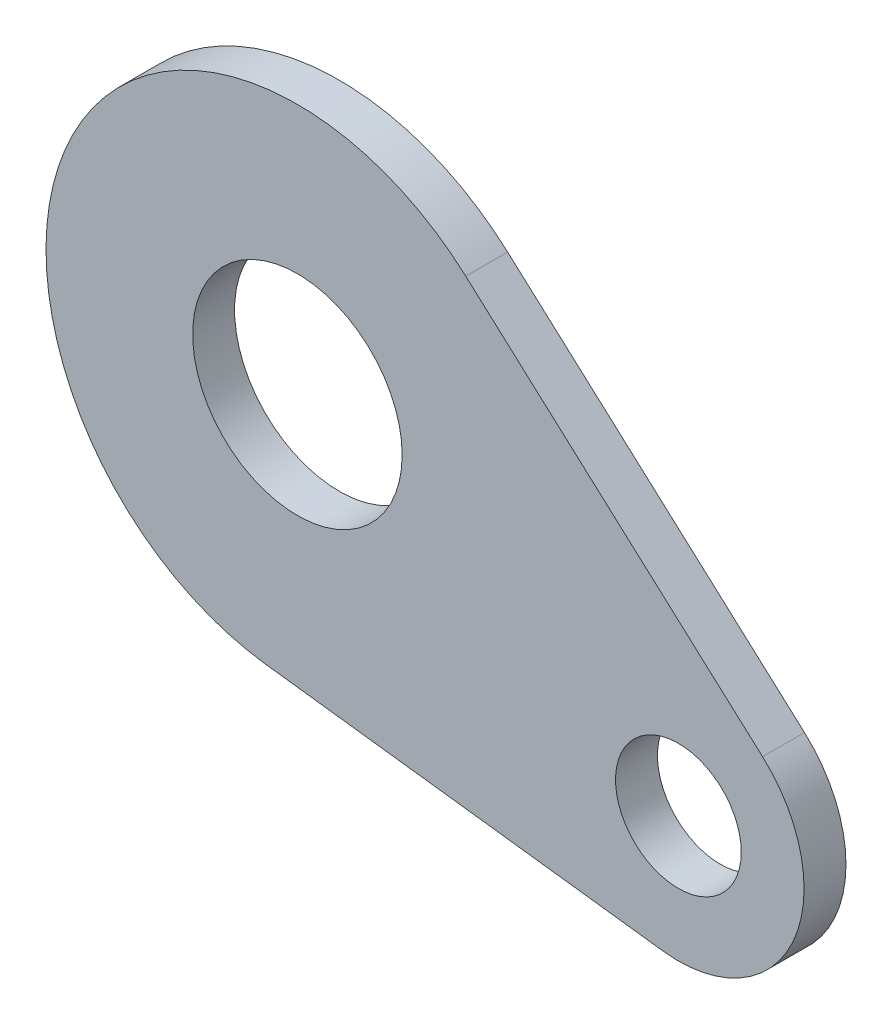
ISO-10303-21;
HEADER;
FILE_DESCRIPTION(('STEP AP214'),'2;1');
FILE_NAME('part.step','',(''),(''),'','','');
FILE_SCHEMA(('AUTOMOTIVE_DESIGN { 1 0 10303 214 1 1 1 1 }'));
ENDSEC;
DATA;
#1=APPLICATION_CONTEXT('core data for automotive mechanical design processes');
#2=APPLICATION_PROTOCOL_DEFINITION('international standard','automotive_design',2000,#1);
#3=PRODUCT_CONTEXT('',#1,'mechanical');
#4=PRODUCT('Part','Part','',(#3));
#5=PRODUCT_RELATED_PRODUCT_CATEGORY('part','',(#4));
#6=PRODUCT_DEFINITION_FORMATION('','',#4);
#7=PRODUCT_DEFINITION_CONTEXT('part definition',#1,'design');
#8=PRODUCT_DEFINITION('design','',#6,#7);
#9=PRODUCT_DEFINITION_SHAPE('','',#8);
#10=(LENGTH_UNIT() NAMED_UNIT(*) SI_UNIT(.MILLI.,.METRE.));
#11=(NAMED_UNIT(*) PLANE_ANGLE_UNIT() SI_UNIT($,.RADIAN.));
#12=(NAMED_UNIT(*) SI_UNIT($,.STERADIAN.) SOLID_ANGLE_UNIT());
#13=UNCERTAINTY_MEASURE_WITH_UNIT(LENGTH_MEASURE(1.E-05),#10,'distance_accuracy_value','');
#14=(GEOMETRIC_REPRESENTATION_CONTEXT(3) GLOBAL_UNCERTAINTY_ASSIGNED_CONTEXT((#13)) GLOBAL_UNIT_ASSIGNED_CONTEXT((#10,
#11,#12)) REPRESENTATION_CONTEXT('',''));
#15=CARTESIAN_POINT('',(0.,0.,0.));
#16=DIRECTION('',(0.,0.,1.));
#17=DIRECTION('',(1.,0.,0.));
#18=AXIS2_PLACEMENT_3D('',#15,#16,#17);
#19=CARTESIAN_POINT('',(-104.570506238801,47.8540408425545,1.));
#20=DIRECTION('',(0.,0.,-1.));
#21=DIRECTION('',(-1.,0.,0.));
#22=AXIS2_PLACEMENT_3D('',#19,#20,#21);
#23=CYLINDRICAL_SURFACE('',#22,3.);
#24=CARTESIAN_POINT('',(-104.570506238801,47.8540408425545,0.));
#25=DIRECTION('',(0.,0.,1.));
#26=DIRECTION('',(1.,0.,0.));
#27=AXIS2_PLACEMENT_3D('',#24,#25,#26);
#28=CIRCLE('',#27,3.);
#29=CARTESIAN_POINT('',(-102.561262828952,50.0818067458704,0.));
#30=VERTEX_POINT('',#29);
#31=CARTESIAN_POINT('',(-104.942993898826,44.8772551695291,0.));
#32=VERTEX_POINT('',#31);
#33=EDGE_CURVE('E105',#30,#32,#28,.F.);
#34=ORIENTED_EDGE('',*,*,#33,.F.);
#35=DIRECTION('',(0.,0.,-1.));
#36=VECTOR('',#35,1.);
#37=CARTESIAN_POINT('',(-102.561262828952,50.0818067458704,1.));
#38=LINE('',#37,#36);
#39=CARTESIAN_POINT('',(-102.561262828952,50.0818067458704,1.));
#40=VERTEX_POINT('',#39);
#41=EDGE_CURVE('E11',#40,#30,#38,.T.);
#42=ORIENTED_EDGE('',*,*,#41,.F.);
#43=CARTESIAN_POINT('',(-104.570506238801,47.8540408425545,1.));
#44=DIRECTION('',(0.,0.,1.));
#45=DIRECTION('',(1.,0.,0.));
#46=AXIS2_PLACEMENT_3D('',#43,#44,#45);
#47=CIRCLE('',#46,3.);
#48=CARTESIAN_POINT('',(-104.942993898826,44.8772551695291,1.));
#49=VERTEX_POINT('',#48);
#50=EDGE_CURVE('E91',#40,#49,#47,.F.);
#51=ORIENTED_EDGE('',*,*,#50,.T.);
#52=DIRECTION('',(0.,0.,-1.));
#53=VECTOR('',#52,1.);
#54=CARTESIAN_POINT('',(-104.942993898826,44.8772551695291,1.));
#55=LINE('',#54,#53);
#56=EDGE_CURVE('E51',#49,#32,#55,.T.);
#57=ORIENTED_EDGE('',*,*,#56,.T.);
#58=EDGE_LOOP('',(#34,#42,#51,#57));
#59=FACE_BOUND('',#58,.T.);
#60=ADVANCED_FACE('F35',(#59),#23,.T.);
#61=CARTESIAN_POINT('',(-21.0970558034188,-23.3915419848165,1.));
#62=DIRECTION('',(0.669747803283137,0.742588634438619,0.));
#63=DIRECTION('',(-0.742588634438619,0.669747803283137,0.));
#64=AXIS2_PLACEMENT_3D('',#61,#62,#63);
#65=PLANE('',#64);
#66=DIRECTION('',(0.742588634438619,-0.669747803283137,0.));
#67=VECTOR('',#66,1.);
#68=CARTESIAN_POINT('',(-21.0970558034188,-23.3915419848165,0.));
#69=LINE('',#68,#67);
#70=CARTESIAN_POINT('',(-109.645106918128,56.4707935920171,0.));
#71=VERTEX_POINT('',#70);
#72=EDGE_CURVE('E81',#71,#30,#69,.T.);
#73=ORIENTED_EDGE('',*,*,#72,.F.);
#74=DIRECTION('',(0.,0.,-1.));
#75=VECTOR('',#74,1.);
#76=CARTESIAN_POINT('',(-109.645106918128,56.4707935920171,1.));
#77=LINE('',#76,#75);
#78=CARTESIAN_POINT('',(-109.645106918128,56.4707935920171,1.));
#79=VERTEX_POINT('',#78);
#80=EDGE_CURVE('E43',#79,#71,#77,.T.);
#81=ORIENTED_EDGE('',*,*,#80,.F.);
#82=DIRECTION('',(0.742588634438619,-0.669747803283137,0.));
#83=VECTOR('',#82,1.);
#84=CARTESIAN_POINT('',(-21.0970558034188,-23.3915419848165,1.));
#85=LINE('',#84,#83);
#86=EDGE_CURVE('E79',#79,#40,#85,.T.);
#87=ORIENTED_EDGE('',*,*,#86,.T.);
#88=ORIENTED_EDGE('',*,*,#41,.T.);
#89=EDGE_LOOP('',(#73,#81,#87,#88));
#90=FACE_BOUND('',#89,.T.);
#91=ADVANCED_FACE('F78',(#90),#65,.T.);
#92=CARTESIAN_POINT('',(-113.663593737827,52.0152617853854,1.));
#93=DIRECTION('',(0.,0.,-1.));
#94=DIRECTION('',(-1.,0.,0.));
#95=AXIS2_PLACEMENT_3D('',#92,#93,#94);
#96=CYLINDRICAL_SURFACE('',#95,6.00000000000001);
#97=CARTESIAN_POINT('',(-113.663593737827,52.0152617853854,0.));
#98=DIRECTION('',(0.,0.,1.));
#99=DIRECTION('',(1.,0.,0.));
#100=AXIS2_PLACEMENT_3D('',#97,#98,#99);
#101=CIRCLE('',#100,6.00000000000001);
#102=CARTESIAN_POINT('',(-114.408569057877,46.0616904393346,0.));
#103=VERTEX_POINT('',#102);
#104=EDGE_CURVE('E108',#103,#71,#101,.F.);
#105=ORIENTED_EDGE('',*,*,#104,.F.);
#106=DIRECTION('',(0.,0.,-1.));
#107=VECTOR('',#106,1.);
#108=CARTESIAN_POINT('',(-114.408569057877,46.0616904393346,1.));
#109=LINE('',#108,#107);
#110=CARTESIAN_POINT('',(-114.408569057877,46.0616904393346,1.));
#111=VERTEX_POINT('',#110);
#112=EDGE_CURVE('E64',#111,#103,#109,.T.);
#113=ORIENTED_EDGE('',*,*,#112,.F.);
#114=CARTESIAN_POINT('',(-113.663593737827,52.0152617853854,1.));
#115=DIRECTION('',(0.,0.,1.));
#116=DIRECTION('',(1.,0.,0.));
#117=AXIS2_PLACEMENT_3D('',#114,#115,#116);
#118=CIRCLE('',#117,6.00000000000001);
#119=EDGE_CURVE('E90',#111,#79,#118,.F.);
#120=ORIENTED_EDGE('',*,*,#119,.T.);
#121=ORIENTED_EDGE('',*,*,#80,.T.);
#122=EDGE_LOOP('',(#105,#113,#120,#121));
#123=FACE_BOUND('',#122,.T.);
#124=ADVANCED_FACE('F93',(#123),#96,.T.);
#125=CARTESIAN_POINT('',(-113.663593737827,52.0152617853854,1.));
#126=DIRECTION('',(0.,0.,-1.));
#127=DIRECTION('',(-1.,0.,0.));
#128=AXIS2_PLACEMENT_3D('',#125,#126,#127);
#129=CYLINDRICAL_SURFACE('',#128,2.5);
#130=CARTESIAN_POINT('',(-113.663593737827,52.0152617853854,1.));
#131=DIRECTION('',(0.,0.,1.));
#132=DIRECTION('',(1.,0.,0.));
#133=AXIS2_PLACEMENT_3D('',#130,#131,#132);
#134=CIRCLE('',#133,2.5);
#135=CARTESIAN_POINT('',(-111.163593737827,52.0152617853854,1.));
#136=VERTEX_POINT('',#135);
#137=EDGE_CURVE('E96',#136,#136,#134,.T.);
#138=ORIENTED_EDGE('',*,*,#137,.T.);
#139=EDGE_LOOP('',(#138));
#140=FACE_BOUND('',#139,.T.);
#141=CARTESIAN_POINT('',(-113.663593737827,52.0152617853854,0.));
#142=DIRECTION('',(0.,0.,1.));
#143=DIRECTION('',(1.,0.,0.));
#144=AXIS2_PLACEMENT_3D('',#141,#142,#143);
#145=CIRCLE('',#144,2.5);
#146=CARTESIAN_POINT('',(-111.163593737827,52.0152617853854,0.));
#147=VERTEX_POINT('',#146);
#148=EDGE_CURVE('E113',#147,#147,#145,.T.);
#149=ORIENTED_EDGE('',*,*,#148,.F.);
#150=EDGE_LOOP('',(#149));
#151=FACE_BOUND('',#150,.T.);
#152=ADVANCED_FACE('F125',(#140,#151),#129,.F.);
#153=CARTESIAN_POINT('',(3.91112043025933,31.2562495667668,1.));
#154=DIRECTION('',(-0.124162553341566,-0.992261891008469,0.));
#155=DIRECTION('',(0.992261891008469,-0.124162553341566,0.));
#156=AXIS2_PLACEMENT_3D('',#153,#154,#155);
#157=PLANE('',#156);
#158=DIRECTION('',(-0.992261891008469,0.124162553341566,0.));
#159=VECTOR('',#158,1.);
#160=CARTESIAN_POINT('',(3.91112043025933,31.2562495667668,0.));
#161=LINE('',#160,#159);
#162=EDGE_CURVE('E110',#32,#103,#161,.T.);
#163=ORIENTED_EDGE('',*,*,#162,.F.);
#164=ORIENTED_EDGE('',*,*,#56,.F.);
#165=DIRECTION('',(-0.992261891008469,0.124162553341566,0.));
#166=VECTOR('',#165,1.);
#167=CARTESIAN_POINT('',(3.91112043025933,31.2562495667668,1.));
#168=LINE('',#167,#166);
#169=EDGE_CURVE('E94',#49,#111,#168,.T.);
#170=ORIENTED_EDGE('',*,*,#169,.T.);
#171=ORIENTED_EDGE('',*,*,#112,.T.);
#172=EDGE_LOOP('',(#163,#164,#170,#171));
#173=FACE_BOUND('',#172,.T.);
#174=ADVANCED_FACE('F122',(#173),#157,.T.);
#175=CARTESIAN_POINT('',(-104.570506238801,47.8540408425545,1.));
#176=DIRECTION('',(0.,0.,-1.));
#177=DIRECTION('',(-1.,0.,0.));
#178=AXIS2_PLACEMENT_3D('',#175,#176,#177);
#179=CYLINDRICAL_SURFACE('',#178,1.5);
#180=CARTESIAN_POINT('',(-104.570506238801,47.8540408425545,1.));
#181=DIRECTION('',(0.,0.,1.));
#182=DIRECTION('',(1.,0.,0.));
#183=AXIS2_PLACEMENT_3D('',#180,#181,#182);
#184=CIRCLE('',#183,1.5);
#185=CARTESIAN_POINT('',(-103.070506238801,47.8540408425545,1.));
#186=VERTEX_POINT('',#185);
#187=EDGE_CURVE('E102',#186,#186,#184,.T.);
#188=ORIENTED_EDGE('',*,*,#187,.T.);
#189=EDGE_LOOP('',(#188));
#190=FACE_BOUND('',#189,.T.);
#191=CARTESIAN_POINT('',(-104.570506238801,47.8540408425545,0.));
#192=DIRECTION('',(0.,0.,1.));
#193=DIRECTION('',(1.,0.,0.));
#194=AXIS2_PLACEMENT_3D('',#191,#192,#193);
#195=CIRCLE('',#194,1.5);
#196=CARTESIAN_POINT('',(-103.070506238801,47.8540408425545,0.));
#197=VERTEX_POINT('',#196);
#198=EDGE_CURVE('E116',#197,#197,#195,.T.);
#199=ORIENTED_EDGE('',*,*,#198,.F.);
#200=EDGE_LOOP('',(#199));
#201=FACE_BOUND('',#200,.T.);
#202=ADVANCED_FACE('F124',(#190,#201),#179,.F.);
#203=CARTESIAN_POINT('',(0.,0.,1.));
#204=DIRECTION('',(0.,0.,1.));
#205=DIRECTION('',(1.,0.,0.));
#206=AXIS2_PLACEMENT_3D('',#203,#204,#205);
#207=PLANE('',#206);
#208=ORIENTED_EDGE('',*,*,#50,.F.);
#209=ORIENTED_EDGE('',*,*,#86,.F.);
#210=ORIENTED_EDGE('',*,*,#119,.F.);
#211=ORIENTED_EDGE('',*,*,#169,.F.);
#212=EDGE_LOOP('',(#208,#209,#210,#211));
#213=FACE_BOUND('',#212,.T.);
#214=ORIENTED_EDGE('',*,*,#137,.F.);
#215=EDGE_LOOP('',(#214));
#216=FACE_BOUND('',#215,.T.);
#217=ORIENTED_EDGE('',*,*,#187,.F.);
#218=EDGE_LOOP('',(#217));
#219=FACE_BOUND('',#218,.T.);
#220=ADVANCED_FACE('F87',(#213,#216,#219),#207,.T.);
#221=CARTESIAN_POINT('',(0.,0.,0.));
#222=DIRECTION('',(0.,0.,1.));
#223=DIRECTION('',(1.,0.,0.));
#224=AXIS2_PLACEMENT_3D('',#221,#222,#223);
#225=PLANE('',#224);
#226=ORIENTED_EDGE('',*,*,#33,.T.);
#227=ORIENTED_EDGE('',*,*,#162,.T.);
#228=ORIENTED_EDGE('',*,*,#104,.T.);
#229=ORIENTED_EDGE('',*,*,#72,.T.);
#230=EDGE_LOOP('',(#226,#227,#228,#229));
#231=FACE_BOUND('',#230,.T.);
#232=ORIENTED_EDGE('',*,*,#148,.T.);
#233=EDGE_LOOP('',(#232));
#234=FACE_BOUND('',#233,.T.);
#235=ORIENTED_EDGE('',*,*,#198,.T.);
#236=EDGE_LOOP('',(#235));
#237=FACE_BOUND('',#236,.T.);
#238=ADVANCED_FACE('F168',(#231,#234,#237),#225,.F.);
#239=CLOSED_SHELL('',(#60,#91,#124,#152,#174,#202,#220,#238));
#240=MANIFOLD_SOLID_BREP('B2',#239);
#241=ADVANCED_BREP_SHAPE_REPRESENTATION('',(#18,#240),#14);
#242=SHAPE_DEFINITION_REPRESENTATION(#9,#241);
ENDSEC;
END-ISO-10303-21;
